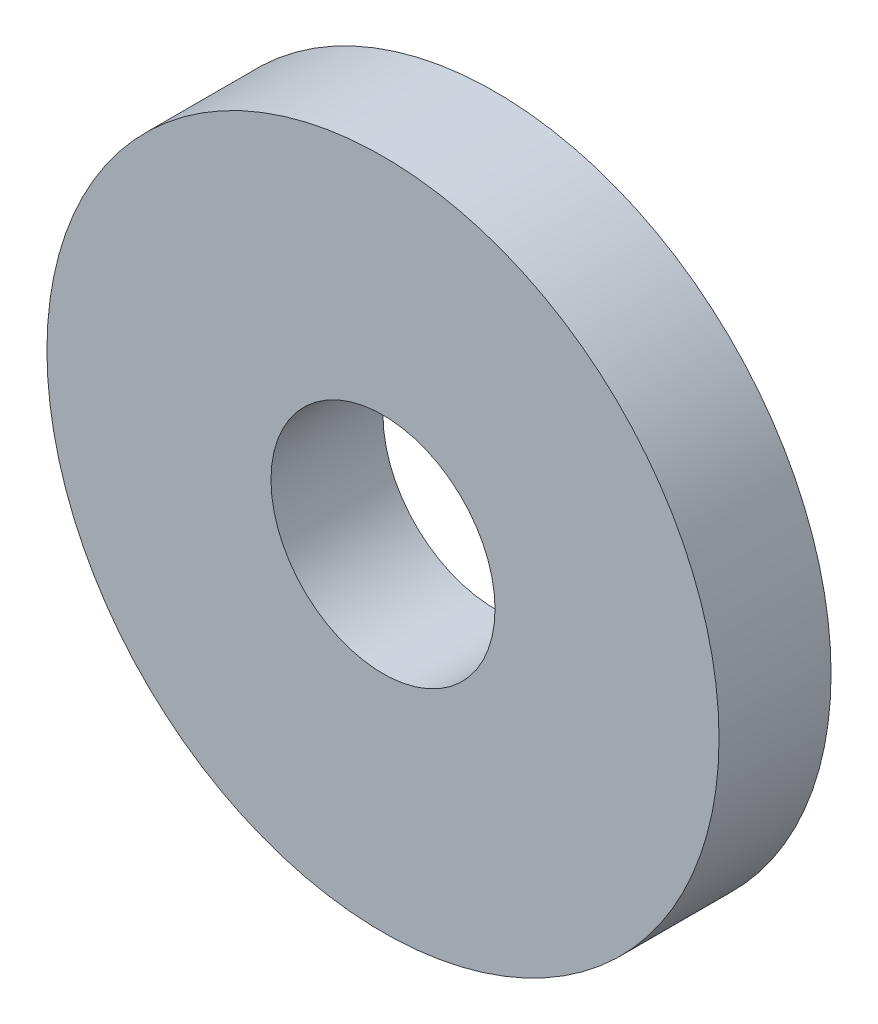
ISO-10303-21;
HEADER;
FILE_DESCRIPTION(('STEP AP214'),'2;1');
FILE_NAME('part.step','',(''),(''),'','','');
FILE_SCHEMA(('AUTOMOTIVE_DESIGN { 1 0 10303 214 1 1 1 1 }'));
ENDSEC;
DATA;
#1=APPLICATION_CONTEXT('core data for automotive mechanical design processes');
#2=APPLICATION_PROTOCOL_DEFINITION('international standard','automotive_design',2000,#1);
#3=PRODUCT_CONTEXT('',#1,'mechanical');
#4=PRODUCT('Part','Part','',(#3));
#5=PRODUCT_RELATED_PRODUCT_CATEGORY('part','',(#4));
#6=PRODUCT_DEFINITION_FORMATION('','',#4);
#7=PRODUCT_DEFINITION_CONTEXT('part definition',#1,'design');
#8=PRODUCT_DEFINITION('design','',#6,#7);
#9=PRODUCT_DEFINITION_SHAPE('','',#8);
#10=(LENGTH_UNIT() NAMED_UNIT(*) SI_UNIT(.MILLI.,.METRE.));
#11=(NAMED_UNIT(*) PLANE_ANGLE_UNIT() SI_UNIT($,.RADIAN.));
#12=(NAMED_UNIT(*) SI_UNIT($,.STERADIAN.) SOLID_ANGLE_UNIT());
#13=UNCERTAINTY_MEASURE_WITH_UNIT(LENGTH_MEASURE(1.E-05),#10,'distance_accuracy_value','');
#14=(GEOMETRIC_REPRESENTATION_CONTEXT(3) GLOBAL_UNCERTAINTY_ASSIGNED_CONTEXT((#13)) GLOBAL_UNIT_ASSIGNED_CONTEXT((#10,
#11,#12)) REPRESENTATION_CONTEXT('',''));
#15=CARTESIAN_POINT('',(0.,0.,0.));
#16=DIRECTION('',(0.,0.,1.));
#17=DIRECTION('',(1.,0.,0.));
#18=AXIS2_PLACEMENT_3D('',#15,#16,#17);
#19=CARTESIAN_POINT('',(0.,0.,3.));
#20=DIRECTION('',(0.,0.,1.));
#21=DIRECTION('',(1.,0.,0.));
#22=AXIS2_PLACEMENT_3D('',#19,#20,#21);
#23=PLANE('',#22);
#24=CARTESIAN_POINT('',(0.,0.,3.));
#25=DIRECTION('',(0.,0.,1.));
#26=DIRECTION('',(1.,0.,0.));
#27=AXIS2_PLACEMENT_3D('',#24,#25,#26);
#28=CIRCLE('',#27,9.);
#29=CARTESIAN_POINT('',(9.,0.,3.));
#30=VERTEX_POINT('',#29);
#31=EDGE_CURVE('E10',#30,#30,#28,.T.);
#32=ORIENTED_EDGE('',*,*,#31,.T.);
#33=EDGE_LOOP('',(#32));
#34=FACE_BOUND('',#33,.T.);
#35=CARTESIAN_POINT('',(0.,0.,3.));
#36=DIRECTION('',(0.,0.,1.));
#37=DIRECTION('',(1.,0.,0.));
#38=AXIS2_PLACEMENT_3D('',#35,#36,#37);
#39=CIRCLE('',#38,3.);
#40=CARTESIAN_POINT('',(3.,0.,3.));
#41=VERTEX_POINT('',#40);
#42=EDGE_CURVE('E40',#41,#41,#39,.T.);
#43=ORIENTED_EDGE('',*,*,#42,.F.);
#44=EDGE_LOOP('',(#43));
#45=FACE_BOUND('',#44,.T.);
#46=ADVANCED_FACE('F29',(#34,#45),#23,.T.);
#47=CARTESIAN_POINT('',(0.,0.,0.));
#48=DIRECTION('',(0.,0.,1.));
#49=DIRECTION('',(1.,0.,0.));
#50=AXIS2_PLACEMENT_3D('',#47,#48,#49);
#51=PLANE('',#50);
#52=CARTESIAN_POINT('',(0.,0.,0.));
#53=DIRECTION('',(0.,0.,1.));
#54=DIRECTION('',(1.,0.,0.));
#55=AXIS2_PLACEMENT_3D('',#52,#53,#54);
#56=CIRCLE('',#55,9.);
#57=CARTESIAN_POINT('',(9.,0.,0.));
#58=VERTEX_POINT('',#57);
#59=EDGE_CURVE('E33',#58,#58,#56,.T.);
#60=ORIENTED_EDGE('',*,*,#59,.F.);
#61=EDGE_LOOP('',(#60));
#62=FACE_BOUND('',#61,.T.);
#63=CARTESIAN_POINT('',(0.,0.,0.));
#64=DIRECTION('',(0.,0.,1.));
#65=DIRECTION('',(1.,0.,0.));
#66=AXIS2_PLACEMENT_3D('',#63,#64,#65);
#67=CIRCLE('',#66,3.);
#68=CARTESIAN_POINT('',(3.,0.,0.));
#69=VERTEX_POINT('',#68);
#70=EDGE_CURVE('E42',#69,#69,#67,.T.);
#71=ORIENTED_EDGE('',*,*,#70,.T.);
#72=EDGE_LOOP('',(#71));
#73=FACE_BOUND('',#72,.T.);
#74=ADVANCED_FACE('F52',(#62,#73),#51,.F.);
#75=CARTESIAN_POINT('',(0.,0.,3.));
#76=DIRECTION('',(0.,0.,-1.));
#77=DIRECTION('',(-1.,0.,0.));
#78=AXIS2_PLACEMENT_3D('',#75,#76,#77);
#79=CYLINDRICAL_SURFACE('',#78,9.);
#80=ORIENTED_EDGE('',*,*,#31,.F.);
#81=EDGE_LOOP('',(#80));
#82=FACE_BOUND('',#81,.T.);
#83=ORIENTED_EDGE('',*,*,#59,.T.);
#84=EDGE_LOOP('',(#83));
#85=FACE_BOUND('',#84,.T.);
#86=ADVANCED_FACE('F31',(#82,#85),#79,.T.);
#87=CARTESIAN_POINT('',(0.,0.,3.));
#88=DIRECTION('',(0.,0.,-1.));
#89=DIRECTION('',(-1.,0.,0.));
#90=AXIS2_PLACEMENT_3D('',#87,#88,#89);
#91=CYLINDRICAL_SURFACE('',#90,3.);
#92=ORIENTED_EDGE('',*,*,#42,.T.);
#93=EDGE_LOOP('',(#92));
#94=FACE_BOUND('',#93,.T.);
#95=ORIENTED_EDGE('',*,*,#70,.F.);
#96=EDGE_LOOP('',(#95));
#97=FACE_BOUND('',#96,.T.);
#98=ADVANCED_FACE('F48',(#94,#97),#91,.F.);
#99=CLOSED_SHELL('',(#46,#74,#86,#98));
#100=MANIFOLD_SOLID_BREP('B2',#99);
#101=ADVANCED_BREP_SHAPE_REPRESENTATION('',(#18,#100),#14);
#102=SHAPE_DEFINITION_REPRESENTATION(#9,#101);
ENDSEC;
END-ISO-10303-21;
